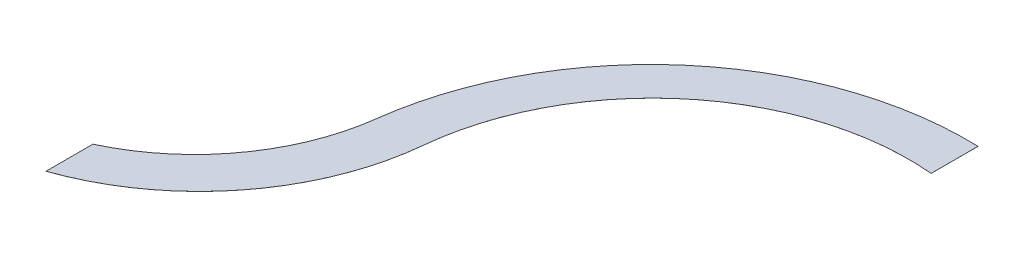
ISO-10303-21;
HEADER;
FILE_DESCRIPTION(('STEP AP214'),'2;1');
FILE_NAME('part.step','',(''),(''),'','','');
FILE_SCHEMA(('AUTOMOTIVE_DESIGN { 1 0 10303 214 1 1 1 1 }'));
ENDSEC;
DATA;
#1=APPLICATION_CONTEXT('core data for automotive mechanical design processes');
#2=APPLICATION_PROTOCOL_DEFINITION('international standard','automotive_design',2000,#1);
#3=PRODUCT_CONTEXT('',#1,'mechanical');
#4=PRODUCT('Part','Part','',(#3));
#5=PRODUCT_RELATED_PRODUCT_CATEGORY('part','',(#4));
#6=PRODUCT_DEFINITION_FORMATION('','',#4);
#7=PRODUCT_DEFINITION_CONTEXT('part definition',#1,'design');
#8=PRODUCT_DEFINITION('design','',#6,#7);
#9=PRODUCT_DEFINITION_SHAPE('','',#8);
#10=(LENGTH_UNIT() NAMED_UNIT(*) SI_UNIT(.MILLI.,.METRE.));
#11=(NAMED_UNIT(*) PLANE_ANGLE_UNIT() SI_UNIT($,.RADIAN.));
#12=(NAMED_UNIT(*) SI_UNIT($,.STERADIAN.) SOLID_ANGLE_UNIT());
#13=UNCERTAINTY_MEASURE_WITH_UNIT(LENGTH_MEASURE(1.E-05),#10,'distance_accuracy_value','');
#14=(GEOMETRIC_REPRESENTATION_CONTEXT(3) GLOBAL_UNCERTAINTY_ASSIGNED_CONTEXT((#13)) GLOBAL_UNIT_ASSIGNED_CONTEXT((#10,
#11,#12)) REPRESENTATION_CONTEXT('',''));
#15=CARTESIAN_POINT('',(0.,0.,0.));
#16=DIRECTION('',(0.,0.,1.));
#17=DIRECTION('',(1.,0.,0.));
#18=AXIS2_PLACEMENT_3D('',#15,#16,#17);
#19=CARTESIAN_POINT('',(445.560010971712,0.01,-918.793169013475));
#20=DIRECTION('',(0.,-1.,0.));
#21=DIRECTION('',(0.,0.,-1.));
#22=AXIS2_PLACEMENT_3D('',#19,#20,#21);
#23=CYLINDRICAL_SURFACE('',#22,106.624335452094);
#24=CARTESIAN_POINT('',(445.560010971712,0.,-918.793169013475));
#25=DIRECTION('',(0.,-1.,0.));
#26=DIRECTION('',(0.,0.,-1.));
#27=AXIS2_PLACEMENT_3D('',#24,#25,#26);
#28=CIRCLE('',#27,106.624335452094);
#29=CARTESIAN_POINT('',(551.653165318692,0.,-908.163422482761));
#30=VERTEX_POINT('',#29);
#31=CARTESIAN_POINT('',(480.747678864046,0.,-818.142401808749));
#32=VERTEX_POINT('',#31);
#33=EDGE_CURVE('E128',#30,#32,#28,.T.);
#34=ORIENTED_EDGE('',*,*,#33,.F.);
#35=DIRECTION('',(0.,-1.,0.));
#36=VECTOR('',#35,1.);
#37=CARTESIAN_POINT('',(551.653165318692,0.01,-908.163422482761));
#38=LINE('',#37,#36);
#39=CARTESIAN_POINT('',(551.653165318692,0.01,-908.163422482761));
#40=VERTEX_POINT('',#39);
#41=EDGE_CURVE('E11',#40,#30,#38,.T.);
#42=ORIENTED_EDGE('',*,*,#41,.F.);
#43=CARTESIAN_POINT('',(445.560010971712,0.01,-918.793169013475));
#44=DIRECTION('',(0.,-1.,0.));
#45=DIRECTION('',(0.,0.,-1.));
#46=AXIS2_PLACEMENT_3D('',#43,#44,#45);
#47=CIRCLE('',#46,106.624335452094);
#48=CARTESIAN_POINT('',(480.747678864046,0.01,-818.142401808749));
#49=VERTEX_POINT('',#48);
#50=EDGE_CURVE('E146',#40,#49,#47,.T.);
#51=ORIENTED_EDGE('',*,*,#50,.T.);
#52=DIRECTION('',(0.,-1.,0.));
#53=VECTOR('',#52,1.);
#54=CARTESIAN_POINT('',(480.747678864046,0.01,-818.142401808749));
#55=LINE('',#54,#53);
#56=EDGE_CURVE('E42',#49,#32,#55,.T.);
#57=ORIENTED_EDGE('',*,*,#56,.T.);
#58=EDGE_LOOP('',(#34,#42,#51,#57));
#59=FACE_BOUND('',#58,.T.);
#60=ADVANCED_FACE('F39',(#59),#23,.T.);
#61=CARTESIAN_POINT('',(660.480091569478,0.01,-897.259772300213));
#62=DIRECTION('',(0.,-1.,0.));
#63=DIRECTION('',(0.,0.,-1.));
#64=AXIS2_PLACEMENT_3D('',#61,#62,#63);
#65=CYLINDRICAL_SURFACE('',#64,109.371794647876);
#66=CARTESIAN_POINT('',(660.480091569478,0.,-897.259772300213));
#67=DIRECTION('',(0.,-1.,0.));
#68=DIRECTION('',(0.,0.,-1.));
#69=AXIS2_PLACEMENT_3D('',#66,#67,#68);
#70=CIRCLE('',#69,109.371794647876);
#71=CARTESIAN_POINT('',(670.398690008265,0.,-1006.18089453785));
#72=VERTEX_POINT('',#71);
#73=EDGE_CURVE('E144',#30,#72,#70,.T.);
#74=ORIENTED_EDGE('',*,*,#73,.T.);
#75=DIRECTION('',(0.,-1.,0.));
#76=VECTOR('',#75,1.);
#77=CARTESIAN_POINT('',(670.398690008265,0.01,-1006.18089453785));
#78=LINE('',#77,#76);
#79=CARTESIAN_POINT('',(670.398690008265,0.01,-1006.18089453785));
#80=VERTEX_POINT('',#79);
#81=EDGE_CURVE('E49',#80,#72,#78,.T.);
#82=ORIENTED_EDGE('',*,*,#81,.F.);
#83=CARTESIAN_POINT('',(660.480091569478,0.01,-897.259772300213));
#84=DIRECTION('',(0.,-1.,0.));
#85=DIRECTION('',(0.,0.,-1.));
#86=AXIS2_PLACEMENT_3D('',#83,#84,#85);
#87=CIRCLE('',#86,109.371794647876);
#88=EDGE_CURVE('E114',#40,#80,#87,.T.);
#89=ORIENTED_EDGE('',*,*,#88,.F.);
#90=ORIENTED_EDGE('',*,*,#41,.T.);
#91=EDGE_LOOP('',(#74,#82,#89,#90));
#92=FACE_BOUND('',#91,.T.);
#93=ADVANCED_FACE('F162',(#92),#65,.F.);
#94=CARTESIAN_POINT('',(670.398690008266,0.01,-1026.18089453788));
#95=DIRECTION('',(1.,0.,0.));
#96=DIRECTION('',(0.,0.,-1.));
#97=AXIS2_PLACEMENT_3D('',#94,#95,#96);
#98=PLANE('',#97);
#99=DIRECTION('',(0.,0.,1.));
#100=VECTOR('',#99,1.);
#101=CARTESIAN_POINT('',(670.398690008266,0.,-1026.18089453788));
#102=LINE('',#101,#100);
#103=CARTESIAN_POINT('',(670.398690008266,0.,-1026.18089453788));
#104=VERTEX_POINT('',#103);
#105=EDGE_CURVE('E103',#104,#72,#102,.T.);
#106=ORIENTED_EDGE('',*,*,#105,.F.);
#107=DIRECTION('',(0.,-1.,0.));
#108=VECTOR('',#107,1.);
#109=CARTESIAN_POINT('',(670.398690008266,0.01,-1026.18089453788));
#110=LINE('',#109,#108);
#111=CARTESIAN_POINT('',(670.398690008266,0.01,-1026.18089453788));
#112=VERTEX_POINT('',#111);
#113=EDGE_CURVE('E98',#112,#104,#110,.T.);
#114=ORIENTED_EDGE('',*,*,#113,.F.);
#115=DIRECTION('',(0.,0.,1.));
#116=VECTOR('',#115,1.);
#117=CARTESIAN_POINT('',(670.398690008266,0.01,-1026.18089453788));
#118=LINE('',#117,#116);
#119=EDGE_CURVE('E101',#112,#80,#118,.T.);
#120=ORIENTED_EDGE('',*,*,#119,.T.);
#121=ORIENTED_EDGE('',*,*,#81,.T.);
#122=EDGE_LOOP('',(#106,#114,#120,#121));
#123=FACE_BOUND('',#122,.T.);
#124=ADVANCED_FACE('F100',(#123),#98,.T.);
#125=CARTESIAN_POINT('',(665.936631407723,0.01,-891.087745942468));
#126=DIRECTION('',(0.,-1.,0.));
#127=DIRECTION('',(0.,0.,-1.));
#128=AXIS2_PLACEMENT_3D('',#125,#126,#127);
#129=CYLINDRICAL_SURFACE('',#128,135.166818281625);
#130=CARTESIAN_POINT('',(665.936631407723,0.,-891.087745942468));
#131=DIRECTION('',(0.,-1.,0.));
#132=DIRECTION('',(0.,0.,-1.));
#133=AXIS2_PLACEMENT_3D('',#130,#131,#132);
#134=CIRCLE('',#133,135.166818281625);
#135=CARTESIAN_POINT('',(531.852739626985,0.,-908.163422482782));
#136=VERTEX_POINT('',#135);
#137=EDGE_CURVE('E139',#136,#104,#134,.T.);
#138=ORIENTED_EDGE('',*,*,#137,.F.);
#139=DIRECTION('',(0.,-1.,0.));
#140=VECTOR('',#139,1.);
#141=CARTESIAN_POINT('',(531.852739626985,0.01,-908.163422482782));
#142=LINE('',#141,#140);
#143=CARTESIAN_POINT('',(531.852739626985,0.01,-908.163422482782));
#144=VERTEX_POINT('',#143);
#145=EDGE_CURVE('E109',#144,#136,#142,.T.);
#146=ORIENTED_EDGE('',*,*,#145,.F.);
#147=CARTESIAN_POINT('',(665.936631407723,0.01,-891.087745942468));
#148=DIRECTION('',(0.,-1.,0.));
#149=DIRECTION('',(0.,0.,-1.));
#150=AXIS2_PLACEMENT_3D('',#147,#148,#149);
#151=CIRCLE('',#150,135.166818281625);
#152=EDGE_CURVE('E113',#144,#112,#151,.T.);
#153=ORIENTED_EDGE('',*,*,#152,.T.);
#154=ORIENTED_EDGE('',*,*,#113,.T.);
#155=EDGE_LOOP('',(#138,#146,#153,#154));
#156=FACE_BOUND('',#155,.T.);
#157=ADVANCED_FACE('F117',(#156),#129,.T.);
#158=CARTESIAN_POINT('',(442.790685050399,0.01,-919.50553685438));
#159=DIRECTION('',(0.,-1.,0.));
#160=DIRECTION('',(0.,0.,-1.));
#161=AXIS2_PLACEMENT_3D('',#158,#159,#160);
#162=CYLINDRICAL_SURFACE('',#161,89.7813628979939);
#163=CARTESIAN_POINT('',(442.790685050399,0.,-919.50553685438));
#164=DIRECTION('',(0.,-1.,0.));
#165=DIRECTION('',(0.,0.,-1.));
#166=AXIS2_PLACEMENT_3D('',#163,#164,#165);
#167=CIRCLE('',#166,89.7813628979939);
#168=CARTESIAN_POINT('',(480.747678864038,0.,-838.142401808755));
#169=VERTEX_POINT('',#168);
#170=EDGE_CURVE('E136',#136,#169,#167,.T.);
#171=ORIENTED_EDGE('',*,*,#170,.T.);
#172=DIRECTION('',(0.,-1.,0.));
#173=VECTOR('',#172,1.);
#174=CARTESIAN_POINT('',(480.747678864038,0.01,-838.142401808755));
#175=LINE('',#174,#173);
#176=CARTESIAN_POINT('',(480.747678864038,0.01,-838.142401808755));
#177=VERTEX_POINT('',#176);
#178=EDGE_CURVE('E151',#177,#169,#175,.T.);
#179=ORIENTED_EDGE('',*,*,#178,.F.);
#180=CARTESIAN_POINT('',(442.790685050399,0.01,-919.50553685438));
#181=DIRECTION('',(0.,-1.,0.));
#182=DIRECTION('',(0.,0.,-1.));
#183=AXIS2_PLACEMENT_3D('',#180,#181,#182);
#184=CIRCLE('',#183,89.7813628979939);
#185=EDGE_CURVE('E120',#144,#177,#184,.T.);
#186=ORIENTED_EDGE('',*,*,#185,.F.);
#187=ORIENTED_EDGE('',*,*,#145,.T.);
#188=EDGE_LOOP('',(#171,#179,#186,#187));
#189=FACE_BOUND('',#188,.T.);
#190=ADVANCED_FACE('F178',(#189),#162,.F.);
#191=CARTESIAN_POINT('',(480.747678864038,0.01,-838.142401808754));
#192=DIRECTION('',(1.,0.,-3.66373598126212E-13));
#193=DIRECTION('',(-3.66373598126212E-13,0.,-1.));
#194=AXIS2_PLACEMENT_3D('',#191,#192,#193);
#195=PLANE('',#194);
#196=DIRECTION('',(3.66373598126212E-13,0.,1.));
#197=VECTOR('',#196,1.);
#198=CARTESIAN_POINT('',(480.747678864038,0.,-838.142401808754));
#199=LINE('',#198,#197);
#200=EDGE_CURVE('E132',#169,#32,#199,.T.);
#201=ORIENTED_EDGE('',*,*,#200,.T.);
#202=ORIENTED_EDGE('',*,*,#56,.F.);
#203=DIRECTION('',(3.66373598126212E-13,0.,1.));
#204=VECTOR('',#203,1.);
#205=CARTESIAN_POINT('',(480.747678864038,0.01,-838.142401808754));
#206=LINE('',#205,#204);
#207=EDGE_CURVE('E91',#177,#49,#206,.T.);
#208=ORIENTED_EDGE('',*,*,#207,.F.);
#209=ORIENTED_EDGE('',*,*,#178,.T.);
#210=EDGE_LOOP('',(#201,#202,#208,#209));
#211=FACE_BOUND('',#210,.T.);
#212=ADVANCED_FACE('F158',(#211),#195,.F.);
#213=CARTESIAN_POINT('',(445.560010971712,0.01,-918.793169013475));
#214=DIRECTION('',(0.,-1.,0.));
#215=DIRECTION('',(0.,0.,-1.));
#216=AXIS2_PLACEMENT_3D('',#213,#214,#215);
#217=PLANE('',#216);
#218=ORIENTED_EDGE('',*,*,#50,.F.);
#219=ORIENTED_EDGE('',*,*,#88,.T.);
#220=ORIENTED_EDGE('',*,*,#119,.F.);
#221=ORIENTED_EDGE('',*,*,#152,.F.);
#222=ORIENTED_EDGE('',*,*,#185,.T.);
#223=ORIENTED_EDGE('',*,*,#207,.T.);
#224=EDGE_LOOP('',(#218,#219,#220,#221,#222,#223));
#225=FACE_BOUND('',#224,.T.);
#226=ADVANCED_FACE('F112',(#225),#217,.F.);
#227=CARTESIAN_POINT('',(445.560010971712,0.,-918.793169013475));
#228=DIRECTION('',(0.,-1.,0.));
#229=DIRECTION('',(0.,0.,-1.));
#230=AXIS2_PLACEMENT_3D('',#227,#228,#229);
#231=PLANE('',#230);
#232=ORIENTED_EDGE('',*,*,#33,.T.);
#233=ORIENTED_EDGE('',*,*,#200,.F.);
#234=ORIENTED_EDGE('',*,*,#170,.F.);
#235=ORIENTED_EDGE('',*,*,#137,.T.);
#236=ORIENTED_EDGE('',*,*,#105,.T.);
#237=ORIENTED_EDGE('',*,*,#73,.F.);
#238=EDGE_LOOP('',(#232,#233,#234,#235,#236,#237));
#239=FACE_BOUND('',#238,.T.);
#240=ADVANCED_FACE('F161',(#239),#231,.T.);
#241=CLOSED_SHELL('',(#60,#93,#124,#157,#190,#212,#226,#240));
#242=MANIFOLD_SOLID_BREP('B2',#241);
#243=ADVANCED_BREP_SHAPE_REPRESENTATION('',(#18,#242),#14);
#244=SHAPE_DEFINITION_REPRESENTATION(#9,#243);
ENDSEC;
END-ISO-10303-21;
